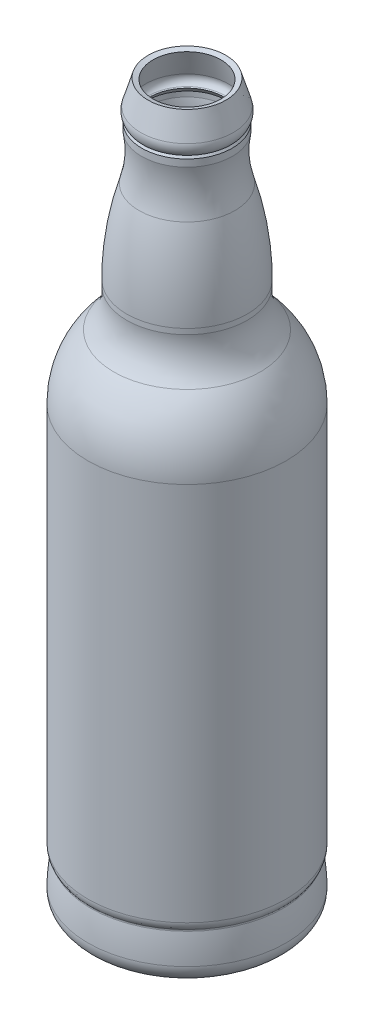
ISO-10303-21;
HEADER;
FILE_DESCRIPTION(('STEP AP214'),'2;1');
FILE_NAME('part.step','',(''),(''),'','','');
FILE_SCHEMA(('AUTOMOTIVE_DESIGN { 1 0 10303 214 1 1 1 1 }'));
ENDSEC;
DATA;
#1=APPLICATION_CONTEXT('core data for automotive mechanical design processes');
#2=APPLICATION_PROTOCOL_DEFINITION('international standard','automotive_design',2000,#1);
#3=PRODUCT_CONTEXT('',#1,'mechanical');
#4=PRODUCT('Part','Part','',(#3));
#5=PRODUCT_RELATED_PRODUCT_CATEGORY('part','',(#4));
#6=PRODUCT_DEFINITION_FORMATION('','',#4);
#7=PRODUCT_DEFINITION_CONTEXT('part definition',#1,'design');
#8=PRODUCT_DEFINITION('design','',#6,#7);
#9=PRODUCT_DEFINITION_SHAPE('','',#8);
#10=(LENGTH_UNIT() NAMED_UNIT(*) SI_UNIT(.MILLI.,.METRE.));
#11=(NAMED_UNIT(*) PLANE_ANGLE_UNIT() SI_UNIT($,.RADIAN.));
#12=(NAMED_UNIT(*) SI_UNIT($,.STERADIAN.) SOLID_ANGLE_UNIT());
#13=UNCERTAINTY_MEASURE_WITH_UNIT(LENGTH_MEASURE(1.E-05),#10,'distance_accuracy_value','');
#14=(GEOMETRIC_REPRESENTATION_CONTEXT(3) GLOBAL_UNCERTAINTY_ASSIGNED_CONTEXT((#13)) GLOBAL_UNIT_ASSIGNED_CONTEXT((#10,
#11,#12)) REPRESENTATION_CONTEXT('',''));
#15=CARTESIAN_POINT('',(0.,0.,0.));
#16=DIRECTION('',(0.,0.,1.));
#17=DIRECTION('',(1.,0.,0.));
#18=AXIS2_PLACEMENT_3D('',#15,#16,#17);
#19=CARTESIAN_POINT('',(0.,277.5,0.));
#20=DIRECTION('',(0.,1.,0.));
#21=DIRECTION('',(0.,0.,1.));
#22=AXIS2_PLACEMENT_3D('',#19,#20,#21);
#23=CONICAL_SURFACE('',#22,13.25,1.27910514982229);
#24=CARTESIAN_POINT('',(0.,277.5,0.));
#25=DIRECTION('',(0.,1.,0.));
#26=DIRECTION('',(0.,0.,1.));
#27=AXIS2_PLACEMENT_3D('',#24,#25,#26);
#28=CIRCLE('',#27,13.25);
#29=CARTESIAN_POINT('',(0.,277.5,13.25));
#30=VERTEX_POINT('',#29);
#31=EDGE_CURVE('E97',#30,#30,#28,.T.);
#32=ORIENTED_EDGE('',*,*,#31,.F.);
#33=EDGE_LOOP('',(#32));
#34=FACE_BOUND('',#33,.T.);
#35=CARTESIAN_POINT('',(0.,278.075144750772,0.));
#36=DIRECTION('',(0.,-1.,0.));
#37=DIRECTION('',(0.,0.,-1.));
#38=AXIS2_PLACEMENT_3D('',#35,#36,#37);
#39=CIRCLE('',#38,15.1655178191966);
#40=CARTESIAN_POINT('',(0.,278.075144750772,-15.1655178191966));
#41=VERTEX_POINT('',#40);
#42=EDGE_CURVE('E100',#41,#41,#39,.F.);
#43=ORIENTED_EDGE('',*,*,#42,.T.);
#44=EDGE_LOOP('',(#43));
#45=FACE_BOUND('',#44,.T.);
#46=ADVANCED_FACE('F49',(#34,#45),#23,.F.);
#47=CARTESIAN_POINT('',(0.,-17.5593913048287,0.));
#48=DIRECTION('',(0.,1.,0.));
#49=DIRECTION('',(0.,0.,1.));
#50=AXIS2_PLACEMENT_3D('',#47,#48,#49);
#51=CYLINDRICAL_SURFACE('',#50,36.65);
#52=CARTESIAN_POINT('',(0.,168.,0.));
#53=DIRECTION('',(0.,1.,0.));
#54=DIRECTION('',(0.,0.,1.));
#55=AXIS2_PLACEMENT_3D('',#52,#53,#54);
#56=CIRCLE('',#55,36.65);
#57=CARTESIAN_POINT('',(0.,168.,36.65));
#58=VERTEX_POINT('',#57);
#59=EDGE_CURVE('E13',#58,#58,#56,.T.);
#60=ORIENTED_EDGE('',*,*,#59,.T.);
#61=EDGE_LOOP('',(#60));
#62=FACE_BOUND('',#61,.T.);
#63=CARTESIAN_POINT('',(0.,20.0146178905804,0.));
#64=DIRECTION('',(0.,1.,0.));
#65=DIRECTION('',(0.,0.,1.));
#66=AXIS2_PLACEMENT_3D('',#63,#64,#65);
#67=CIRCLE('',#66,36.65);
#68=CARTESIAN_POINT('',(0.,20.0146178905804,36.65));
#69=VERTEX_POINT('',#68);
#70=EDGE_CURVE('E173',#69,#69,#67,.T.);
#71=ORIENTED_EDGE('',*,*,#70,.F.);
#72=EDGE_LOOP('',(#71));
#73=FACE_BOUND('',#72,.T.);
#74=ADVANCED_FACE('F84',(#62,#73),#51,.F.);
#75=CARTESIAN_POINT('',(0.,168.,0.));
#76=DIRECTION('',(0.,1.,0.));
#77=DIRECTION('',(0.,0.,1.));
#78=AXIS2_PLACEMENT_3D('',#75,#76,#77);
#79=DEGENERATE_TOROIDAL_SURFACE('',#78,2.65,34.,.T.);
#80=CARTESIAN_POINT('',(0.,191.598656068639,0.));
#81=DIRECTION('',(0.,1.,0.));
#82=DIRECTION('',(0.,0.,1.));
#83=AXIS2_PLACEMENT_3D('',#80,#81,#82);
#84=CIRCLE('',#83,27.1265894632829);
#85=CARTESIAN_POINT('',(0.,191.598656068639,27.1265894632829));
#86=VERTEX_POINT('',#85);
#87=EDGE_CURVE('E58',#86,#86,#84,.T.);
#88=ORIENTED_EDGE('',*,*,#87,.T.);
#89=EDGE_LOOP('',(#88));
#90=FACE_BOUND('',#89,.T.);
#91=ORIENTED_EDGE('',*,*,#59,.F.);
#92=EDGE_LOOP('',(#91));
#93=FACE_BOUND('',#92,.T.);
#94=ADVANCED_FACE('F91',(#90,#93),#79,.F.);
#95=CARTESIAN_POINT('',(0.,205.827257521789,0.));
#96=DIRECTION('',(0.,1.,0.));
#97=DIRECTION('',(0.,0.,1.));
#98=AXIS2_PLACEMENT_3D('',#95,#96,#97);
#99=TOROIDAL_SURFACE('',#98,41.8845331102622,20.5);
#100=CARTESIAN_POINT('',(0.,208.,0.));
#101=DIRECTION('',(0.,1.,0.));
#102=DIRECTION('',(0.,0.,1.));
#103=AXIS2_PLACEMENT_3D('',#100,#101,#102);
#104=CIRCLE('',#103,21.5);
#105=CARTESIAN_POINT('',(0.,208.,21.5));
#106=VERTEX_POINT('',#105);
#107=EDGE_CURVE('E131',#106,#106,#104,.T.);
#108=ORIENTED_EDGE('',*,*,#107,.T.);
#109=EDGE_LOOP('',(#108));
#110=FACE_BOUND('',#109,.T.);
#111=ORIENTED_EDGE('',*,*,#87,.F.);
#112=EDGE_LOOP('',(#111));
#113=FACE_BOUND('',#112,.T.);
#114=ADVANCED_FACE('F273',(#110,#113),#99,.T.);
#115=CARTESIAN_POINT('',(0.,-17.5593913048287,0.));
#116=DIRECTION('',(0.,1.,0.));
#117=DIRECTION('',(0.,0.,1.));
#118=AXIS2_PLACEMENT_3D('',#115,#116,#117);
#119=CYLINDRICAL_SURFACE('',#118,21.5);
#120=CARTESIAN_POINT('',(0.,210.,0.));
#121=DIRECTION('',(0.,1.,0.));
#122=DIRECTION('',(0.,0.,1.));
#123=AXIS2_PLACEMENT_3D('',#120,#121,#122);
#124=CIRCLE('',#123,21.5);
#125=CARTESIAN_POINT('',(0.,210.,21.5));
#126=VERTEX_POINT('',#125);
#127=EDGE_CURVE('E134',#126,#126,#124,.T.);
#128=ORIENTED_EDGE('',*,*,#127,.T.);
#129=EDGE_LOOP('',(#128));
#130=FACE_BOUND('',#129,.T.);
#131=ORIENTED_EDGE('',*,*,#107,.F.);
#132=EDGE_LOOP('',(#131));
#133=FACE_BOUND('',#132,.T.);
#134=ADVANCED_FACE('F269',(#130,#133),#119,.F.);
#135=CARTESIAN_POINT('',(0.,210.,0.));
#136=DIRECTION('',(0.,1.,0.));
#137=DIRECTION('',(0.,0.,1.));
#138=AXIS2_PLACEMENT_3D('',#135,#136,#137);
#139=DEGENERATE_TOROIDAL_SURFACE('',#138,88.6,110.1,.F.);
#140=CARTESIAN_POINT('',(0.,241.94796364899,0.));
#141=DIRECTION('',(0.,1.,0.));
#142=DIRECTION('',(0.,0.,1.));
#143=AXIS2_PLACEMENT_3D('',#140,#141,#142);
#144=CIRCLE('',#143,16.7628853946343);
#145=CARTESIAN_POINT('',(0.,241.94796364899,16.7628853946343));
#146=VERTEX_POINT('',#145);
#147=EDGE_CURVE('E137',#146,#146,#144,.T.);
#148=ORIENTED_EDGE('',*,*,#147,.T.);
#149=EDGE_LOOP('',(#148));
#150=FACE_BOUND('',#149,.T.);
#151=ORIENTED_EDGE('',*,*,#127,.F.);
#152=EDGE_LOOP('',(#151));
#153=FACE_BOUND('',#152,.T.);
#154=ADVANCED_FACE('F265',(#150,#153),#139,.T.);
#155=CARTESIAN_POINT('',(0.,253.554853258068,0.));
#156=DIRECTION('',(0.,1.,0.));
#157=DIRECTION('',(0.,0.,1.));
#158=AXIS2_PLACEMENT_3D('',#155,#156,#157);
#159=TOROIDAL_SURFACE('',#158,55.041862831377,40.);
#160=CARTESIAN_POINT('',(0.,260.5,0.));
#161=DIRECTION('',(0.,1.,0.));
#162=DIRECTION('',(0.,0.,1.));
#163=AXIS2_PLACEMENT_3D('',#160,#161,#162);
#164=CIRCLE('',#163,15.6494151194991);
#165=CARTESIAN_POINT('',(0.,260.5,15.6494151194991));
#166=VERTEX_POINT('',#165);
#167=EDGE_CURVE('E140',#166,#166,#164,.T.);
#168=ORIENTED_EDGE('',*,*,#167,.T.);
#169=EDGE_LOOP('',(#168));
#170=FACE_BOUND('',#169,.T.);
#171=ORIENTED_EDGE('',*,*,#147,.F.);
#172=EDGE_LOOP('',(#171));
#173=FACE_BOUND('',#172,.T.);
#174=ADVANCED_FACE('F261',(#170,#173),#159,.T.);
#175=CARTESIAN_POINT('',(0.,-17.5593913048287,0.));
#176=DIRECTION('',(0.,1.,0.));
#177=DIRECTION('',(0.,0.,1.));
#178=AXIS2_PLACEMENT_3D('',#175,#176,#177);
#179=CYLINDRICAL_SURFACE('',#178,15.6494151194991);
#180=CARTESIAN_POINT('',(0.,262.5,0.));
#181=DIRECTION('',(0.,1.,0.));
#182=DIRECTION('',(0.,0.,1.));
#183=AXIS2_PLACEMENT_3D('',#180,#181,#182);
#184=CIRCLE('',#183,15.6494151194991);
#185=CARTESIAN_POINT('',(0.,262.5,15.6494151194991));
#186=VERTEX_POINT('',#185);
#187=EDGE_CURVE('E143',#186,#186,#184,.T.);
#188=ORIENTED_EDGE('',*,*,#187,.T.);
#189=EDGE_LOOP('',(#188));
#190=FACE_BOUND('',#189,.T.);
#191=ORIENTED_EDGE('',*,*,#167,.F.);
#192=EDGE_LOOP('',(#191));
#193=FACE_BOUND('',#192,.T.);
#194=ADVANCED_FACE('F257',(#190,#193),#179,.F.);
#195=CARTESIAN_POINT('',(0.,262.5,0.));
#196=DIRECTION('',(0.,-1.,0.));
#197=DIRECTION('',(0.,0.,-1.));
#198=AXIS2_PLACEMENT_3D('',#195,#196,#197);
#199=CONICAL_SURFACE('',#198,15.6494151194991,0.573236750858005);
#200=CARTESIAN_POINT('',(0.,264.322192830936,0.));
#201=DIRECTION('',(0.,1.,0.));
#202=DIRECTION('',(0.,0.,1.));
#203=AXIS2_PLACEMENT_3D('',#200,#201,#202);
#204=CIRCLE('',#203,14.473108375119);
#205=CARTESIAN_POINT('',(0.,264.322192830936,14.473108375119));
#206=VERTEX_POINT('',#205);
#207=EDGE_CURVE('E146',#206,#206,#204,.T.);
#208=ORIENTED_EDGE('',*,*,#207,.T.);
#209=EDGE_LOOP('',(#208));
#210=FACE_BOUND('',#209,.T.);
#211=ORIENTED_EDGE('',*,*,#187,.F.);
#212=EDGE_LOOP('',(#211));
#213=FACE_BOUND('',#212,.T.);
#214=ADVANCED_FACE('F253',(#210,#213),#199,.F.);
#215=CARTESIAN_POINT('',(0.,264.322192830936,0.));
#216=DIRECTION('',(0.,1.,0.));
#217=DIRECTION('',(0.,0.,1.));
#218=AXIS2_PLACEMENT_3D('',#215,#216,#217);
#219=CONICAL_SURFACE('',#218,14.473108375119,0.997559575936823);
#220=CARTESIAN_POINT('',(0.,264.577188359089,0.));
#221=DIRECTION('',(0.,1.,0.));
#222=DIRECTION('',(0.,0.,1.));
#223=AXIS2_PLACEMENT_3D('',#220,#221,#222);
#224=CIRCLE('',#223,14.8681167566846);
#225=CARTESIAN_POINT('',(0.,264.577188359089,14.8681167566846));
#226=VERTEX_POINT('',#225);
#227=EDGE_CURVE('E149',#226,#226,#224,.T.);
#228=ORIENTED_EDGE('',*,*,#227,.T.);
#229=EDGE_LOOP('',(#228));
#230=FACE_BOUND('',#229,.T.);
#231=ORIENTED_EDGE('',*,*,#207,.F.);
#232=EDGE_LOOP('',(#231));
#233=FACE_BOUND('',#232,.T.);
#234=ADVANCED_FACE('F249',(#230,#233),#219,.F.);
#235=CARTESIAN_POINT('',(0.,267.097638099913,0.));
#236=DIRECTION('',(0.,1.,0.));
#237=DIRECTION('',(0.,0.,1.));
#238=AXIS2_PLACEMENT_3D('',#235,#236,#237);
#239=TOROIDAL_SURFACE('',#238,13.2410540338667,2.99999999999999);
#240=CARTESIAN_POINT('',(0.,267.96035522607,0.));
#241=DIRECTION('',(0.,1.,0.));
#242=DIRECTION('',(0.,0.,1.));
#243=AXIS2_PLACEMENT_3D('',#240,#241,#242);
#244=CIRCLE('',#243,16.1143307626617);
#245=CARTESIAN_POINT('',(0.,267.96035522607,16.1143307626617));
#246=VERTEX_POINT('',#245);
#247=EDGE_CURVE('E127',#246,#246,#244,.T.);
#248=ORIENTED_EDGE('',*,*,#247,.T.);
#249=EDGE_LOOP('',(#248));
#250=FACE_BOUND('',#249,.T.);
#251=ORIENTED_EDGE('',*,*,#227,.F.);
#252=EDGE_LOOP('',(#251));
#253=FACE_BOUND('',#252,.T.);
#254=ADVANCED_FACE('F245',(#250,#253),#239,.F.);
#255=CARTESIAN_POINT('',(0.,267.96035522607,0.));
#256=DIRECTION('',(0.,-1.,0.));
#257=DIRECTION('',(0.,0.,-1.));
#258=AXIS2_PLACEMENT_3D('',#255,#256,#257);
#259=CONICAL_SURFACE('',#258,16.1143307626617,0.291691176972609);
#260=ORIENTED_EDGE('',*,*,#31,.T.);
#261=EDGE_LOOP('',(#260));
#262=FACE_BOUND('',#261,.T.);
#263=ORIENTED_EDGE('',*,*,#247,.F.);
#264=EDGE_LOOP('',(#263));
#265=FACE_BOUND('',#264,.T.);
#266=ADVANCED_FACE('F241',(#262,#265),#259,.F.);
#267=CARTESIAN_POINT('',(0.,-17.5593913048287,0.));
#268=DIRECTION('',(0.,1.,0.));
#269=DIRECTION('',(0.,0.,1.));
#270=AXIS2_PLACEMENT_3D('',#267,#268,#269);
#271=CYLINDRICAL_SURFACE('',#270,38.65);
#272=CARTESIAN_POINT('',(0.,168.,0.));
#273=DIRECTION('',(0.,1.,0.));
#274=DIRECTION('',(0.,0.,1.));
#275=AXIS2_PLACEMENT_3D('',#272,#273,#274);
#276=CIRCLE('',#275,38.65);
#277=CARTESIAN_POINT('',(0.,168.,38.65));
#278=VERTEX_POINT('',#277);
#279=EDGE_CURVE('E125',#278,#278,#276,.T.);
#280=ORIENTED_EDGE('',*,*,#279,.F.);
#281=EDGE_LOOP('',(#280));
#282=FACE_BOUND('',#281,.T.);
#283=CARTESIAN_POINT('',(0.,20.0146178905804,0.));
#284=DIRECTION('',(0.,1.,0.));
#285=DIRECTION('',(0.,0.,1.));
#286=AXIS2_PLACEMENT_3D('',#283,#284,#285);
#287=CIRCLE('',#286,38.65);
#288=CARTESIAN_POINT('',(0.,20.0146178905804,38.65));
#289=VERTEX_POINT('',#288);
#290=EDGE_CURVE('E155',#289,#289,#287,.T.);
#291=ORIENTED_EDGE('',*,*,#290,.T.);
#292=EDGE_LOOP('',(#291));
#293=FACE_BOUND('',#292,.T.);
#294=ADVANCED_FACE('F244',(#282,#293),#271,.T.);
#295=CARTESIAN_POINT('',(0.,168.,0.));
#296=DIRECTION('',(0.,1.,0.));
#297=DIRECTION('',(0.,0.,1.));
#298=AXIS2_PLACEMENT_3D('',#295,#296,#297);
#299=DEGENERATE_TOROIDAL_SURFACE('',#298,2.65,36.,.T.);
#300=CARTESIAN_POINT('',(0.,192.986812307971,0.));
#301=DIRECTION('',(0.,1.,0.));
#302=DIRECTION('',(0.,0.,1.));
#303=AXIS2_PLACEMENT_3D('',#300,#301,#302);
#304=CIRCLE('',#303,28.566388843476);
#305=CARTESIAN_POINT('',(0.,192.986812307971,28.566388843476));
#306=VERTEX_POINT('',#305);
#307=EDGE_CURVE('E122',#306,#306,#304,.T.);
#308=ORIENTED_EDGE('',*,*,#307,.F.);
#309=EDGE_LOOP('',(#308));
#310=FACE_BOUND('',#309,.T.);
#311=ORIENTED_EDGE('',*,*,#279,.T.);
#312=EDGE_LOOP('',(#311));
#313=FACE_BOUND('',#312,.T.);
#314=ADVANCED_FACE('F282',(#310,#313),#299,.T.);
#315=CARTESIAN_POINT('',(0.,205.827257521789,0.));
#316=DIRECTION('',(0.,1.,0.));
#317=DIRECTION('',(0.,0.,1.));
#318=AXIS2_PLACEMENT_3D('',#315,#316,#317);
#319=TOROIDAL_SURFACE('',#318,41.8845331102622,18.5);
#320=CARTESIAN_POINT('',(0.,207.890978025557,0.));
#321=DIRECTION('',(0.,-1.,0.));
#322=DIRECTION('',(0.,0.,-1.));
#323=AXIS2_PLACEMENT_3D('',#320,#321,#322);
#324=CIRCLE('',#323,23.5);
#325=CARTESIAN_POINT('',(0.,207.890978025557,-23.5));
#326=VERTEX_POINT('',#325);
#327=EDGE_CURVE('E119',#326,#326,#324,.F.);
#328=ORIENTED_EDGE('',*,*,#327,.F.);
#329=EDGE_LOOP('',(#328));
#330=FACE_BOUND('',#329,.T.);
#331=ORIENTED_EDGE('',*,*,#307,.T.);
#332=EDGE_LOOP('',(#331));
#333=FACE_BOUND('',#332,.T.);
#334=ADVANCED_FACE('F285',(#330,#333),#319,.F.);
#335=CARTESIAN_POINT('',(0.,-17.5593913048287,0.));
#336=DIRECTION('',(0.,1.,0.));
#337=DIRECTION('',(0.,0.,1.));
#338=AXIS2_PLACEMENT_3D('',#335,#336,#337);
#339=CYLINDRICAL_SURFACE('',#338,23.5);
#340=CARTESIAN_POINT('',(0.,210.,0.));
#341=DIRECTION('',(0.,1.,0.));
#342=DIRECTION('',(0.,0.,1.));
#343=AXIS2_PLACEMENT_3D('',#340,#341,#342);
#344=CIRCLE('',#343,23.5);
#345=CARTESIAN_POINT('',(0.,210.,23.5));
#346=VERTEX_POINT('',#345);
#347=EDGE_CURVE('E116',#346,#346,#344,.T.);
#348=ORIENTED_EDGE('',*,*,#347,.F.);
#349=EDGE_LOOP('',(#348));
#350=FACE_BOUND('',#349,.T.);
#351=ORIENTED_EDGE('',*,*,#327,.T.);
#352=EDGE_LOOP('',(#351));
#353=FACE_BOUND('',#352,.T.);
#354=ADVANCED_FACE('F289',(#350,#353),#339,.T.);
#355=CARTESIAN_POINT('',(0.,210.,0.));
#356=DIRECTION('',(0.,1.,0.));
#357=DIRECTION('',(0.,0.,1.));
#358=AXIS2_PLACEMENT_3D('',#355,#356,#357);
#359=DEGENERATE_TOROIDAL_SURFACE('',#358,88.6,112.1,.F.);
#360=CARTESIAN_POINT('',(0.,242.528308129443,0.));
#361=DIRECTION('',(0.,1.,0.));
#362=DIRECTION('',(0.,0.,1.));
#363=AXIS2_PLACEMENT_3D('',#360,#361,#362);
#364=CIRCLE('',#363,18.6768342664714);
#365=CARTESIAN_POINT('',(0.,242.528308129443,18.6768342664714));
#366=VERTEX_POINT('',#365);
#367=EDGE_CURVE('E113',#366,#366,#364,.T.);
#368=ORIENTED_EDGE('',*,*,#367,.F.);
#369=EDGE_LOOP('',(#368));
#370=FACE_BOUND('',#369,.T.);
#371=ORIENTED_EDGE('',*,*,#347,.T.);
#372=EDGE_LOOP('',(#371));
#373=FACE_BOUND('',#372,.T.);
#374=ADVANCED_FACE('F293',(#370,#373),#359,.F.);
#375=CARTESIAN_POINT('',(0.,253.554853258068,0.));
#376=DIRECTION('',(0.,1.,0.));
#377=DIRECTION('',(0.,0.,1.));
#378=AXIS2_PLACEMENT_3D('',#375,#376,#377);
#379=TOROIDAL_SURFACE('',#378,55.041862831377,38.);
#380=CARTESIAN_POINT('',(0.,260.32278160539,0.));
#381=DIRECTION('',(0.,-1.,0.));
#382=DIRECTION('',(0.,0.,-1.));
#383=AXIS2_PLACEMENT_3D('',#380,#381,#382);
#384=CIRCLE('',#383,17.6494151194991);
#385=CARTESIAN_POINT('',(0.,260.32278160539,-17.6494151194991));
#386=VERTEX_POINT('',#385);
#387=EDGE_CURVE('E110',#386,#386,#384,.F.);
#388=ORIENTED_EDGE('',*,*,#387,.F.);
#389=EDGE_LOOP('',(#388));
#390=FACE_BOUND('',#389,.T.);
#391=ORIENTED_EDGE('',*,*,#367,.T.);
#392=EDGE_LOOP('',(#391));
#393=FACE_BOUND('',#392,.T.);
#394=ADVANCED_FACE('F297',(#390,#393),#379,.F.);
#395=CARTESIAN_POINT('',(0.,-17.5593913048287,0.));
#396=DIRECTION('',(0.,1.,0.));
#397=DIRECTION('',(0.,0.,1.));
#398=AXIS2_PLACEMENT_3D('',#395,#396,#397);
#399=CYLINDRICAL_SURFACE('',#398,17.6494151194991);
#400=CARTESIAN_POINT('',(0.,263.089467452547,0.));
#401=DIRECTION('',(0.,-1.,0.));
#402=DIRECTION('',(0.,0.,-1.));
#403=AXIS2_PLACEMENT_3D('',#400,#401,#402);
#404=CIRCLE('',#403,17.6494151194991);
#405=CARTESIAN_POINT('',(0.,263.089467452547,-17.6494151194991));
#406=VERTEX_POINT('',#405);
#407=EDGE_CURVE('E103',#406,#406,#404,.F.);
#408=ORIENTED_EDGE('',*,*,#407,.F.);
#409=EDGE_LOOP('',(#408));
#410=FACE_BOUND('',#409,.T.);
#411=ORIENTED_EDGE('',*,*,#387,.T.);
#412=EDGE_LOOP('',(#411));
#413=FACE_BOUND('',#412,.T.);
#414=ADVANCED_FACE('F301',(#410,#413),#399,.T.);
#415=CARTESIAN_POINT('',(0.,263.584708481879,0.));
#416=DIRECTION('',(0.,-1.,0.));
#417=DIRECTION('',(0.,0.,-1.));
#418=AXIS2_PLACEMENT_3D('',#415,#416,#417);
#419=CONICAL_SURFACE('',#418,17.3297149467146,0.573236750858005);
#420=ORIENTED_EDGE('',*,*,#407,.T.);
#421=EDGE_LOOP('',(#420));
#422=FACE_BOUND('',#421,.T.);
#423=CARTESIAN_POINT('',(0.,263.928060762459,0.));
#424=DIRECTION('',(0.,1.,0.));
#425=DIRECTION('',(0.,0.,1.));
#426=AXIS2_PLACEMENT_3D('',#423,#424,#425);
#427=CIRCLE('',#426,17.1080657356719);
#428=CARTESIAN_POINT('',(0.,263.928060762459,17.1080657356719));
#429=VERTEX_POINT('',#428);
#430=EDGE_CURVE('E52',#429,#429,#427,.T.);
#431=ORIENTED_EDGE('',*,*,#430,.F.);
#432=EDGE_LOOP('',(#431));
#433=FACE_BOUND('',#432,.T.);
#434=ADVANCED_FACE('F305',(#422,#433),#419,.T.);
#435=CARTESIAN_POINT('',(0.,267.097638099913,0.));
#436=DIRECTION('',(0.,1.,0.));
#437=DIRECTION('',(0.,0.,1.));
#438=AXIS2_PLACEMENT_3D('',#435,#436,#437);
#439=TOROIDAL_SURFACE('',#438,13.2410540338667,4.99999999999999);
#440=CARTESIAN_POINT('',(0.,268.535499976842,0.));
#441=DIRECTION('',(0.,1.,0.));
#442=DIRECTION('',(0.,0.,1.));
#443=AXIS2_PLACEMENT_3D('',#440,#441,#442);
#444=CIRCLE('',#443,18.0298485818583);
#445=CARTESIAN_POINT('',(0.,268.535499976842,18.0298485818583));
#446=VERTEX_POINT('',#445);
#447=EDGE_CURVE('E101',#446,#446,#444,.T.);
#448=ORIENTED_EDGE('',*,*,#447,.F.);
#449=EDGE_LOOP('',(#448));
#450=FACE_BOUND('',#449,.T.);
#451=ORIENTED_EDGE('',*,*,#430,.T.);
#452=EDGE_LOOP('',(#451));
#453=FACE_BOUND('',#452,.T.);
#454=ADVANCED_FACE('F78',(#450,#453),#439,.T.);
#455=CARTESIAN_POINT('',(0.,268.535499976842,0.));
#456=DIRECTION('',(0.,-1.,0.));
#457=DIRECTION('',(0.,0.,-1.));
#458=AXIS2_PLACEMENT_3D('',#455,#456,#457);
#459=CONICAL_SURFACE('',#458,18.0298485818583,0.291691176972609);
#460=ORIENTED_EDGE('',*,*,#42,.F.);
#461=EDGE_LOOP('',(#460));
#462=FACE_BOUND('',#461,.T.);
#463=ORIENTED_EDGE('',*,*,#447,.T.);
#464=EDGE_LOOP('',(#463));
#465=FACE_BOUND('',#464,.T.);
#466=ADVANCED_FACE('F67',(#462,#465),#459,.T.);
#467=CARTESIAN_POINT('',(0.,-153.977718049209,1.08777554035935));
#468=DIRECTION('',(-1.,0.,0.));
#469=DIRECTION('',(0.,0.,1.));
#470=AXIS2_PLACEMENT_3D('',#467,#468,#469);
#471=CIRCLE('',#470,154.981486868876);
#472=TRIMMED_CURVE('',#471,(PARAMETER_VALUE(-1.57781512945111)),
(PARAMETER_VALUE(1.57781512945111)),.T.,.PARAMETER.);
#473=CARTESIAN_POINT('',(0.,-153.977718049209,0.));
#474=DIRECTION('',(0.,1.,0.));
#475=AXIS1_PLACEMENT('',#473,#474);
#476=SURFACE_OF_REVOLUTION('',#472,#475);
#477=CARTESIAN_POINT('',(0.,-1.89355797851321,0.));
#478=DIRECTION('',(0.,1.,0.));
#479=DIRECTION('',(0.,0.,1.));
#480=AXIS2_PLACEMENT_3D('',#477,#478,#479);
#481=CIRCLE('',#480,30.9151040777697);
#482=CARTESIAN_POINT('',(0.,-1.89355797851321,30.9151040777697));
#483=VERTEX_POINT('',#482);
#484=EDGE_CURVE('E170',#483,#483,#481,.T.);
#485=ORIENTED_EDGE('',*,*,#484,.F.);
#486=EDGE_LOOP('',(#485));
#487=FACE_BOUND('',#486,.T.);
#488=CARTESIAN_POINT('',(0.,0.999951363069351,0.));
#489=VERTEX_POINT('',#488);
#490=VERTEX_LOOP('',#489);
#491=FACE_BOUND('',#490,.T.);
#492=ADVANCED_FACE('F64',(#487,#491),#476,.F.);
#493=CARTESIAN_POINT('',(0.,3.0129687022951,0.));
#494=DIRECTION('',(0.,1.,0.));
#495=DIRECTION('',(0.,0.,1.));
#496=AXIS2_PLACEMENT_3D('',#493,#494,#495);
#497=TOROIDAL_SURFACE('',#496,31.8773909011839,5.);
#498=CARTESIAN_POINT('',(0.,-1.95460954196712,0.));
#499=DIRECTION('',(0.,1.,0.));
#500=DIRECTION('',(0.,0.,1.));
#501=AXIS2_PLACEMENT_3D('',#498,#499,#500);
#502=CIRCLE('',#501,32.4458681541436);
#503=CARTESIAN_POINT('',(0.,-1.95460954196712,32.4458681541436));
#504=VERTEX_POINT('',#503);
#505=EDGE_CURVE('E167',#504,#504,#502,.T.);
#506=ORIENTED_EDGE('',*,*,#505,.F.);
#507=EDGE_LOOP('',(#506));
#508=FACE_BOUND('',#507,.T.);
#509=ORIENTED_EDGE('',*,*,#484,.T.);
#510=EDGE_LOOP('',(#509));
#511=FACE_BOUND('',#510,.T.);
#512=ADVANCED_FACE('F66',(#508,#511),#497,.T.);
#513=CARTESIAN_POINT('',(0.,5.,0.));
#514=DIRECTION('',(0.,1.,0.));
#515=DIRECTION('',(0.,0.,1.));
#516=AXIS2_PLACEMENT_3D('',#513,#514,#515);
#517=TOROIDAL_SURFACE('',#516,31.65,6.99999999999999);
#518=CARTESIAN_POINT('',(0.,5.2,0.));
#519=DIRECTION('',(0.,1.,0.));
#520=DIRECTION('',(0.,0.,1.));
#521=AXIS2_PLACEMENT_3D('',#518,#519,#520);
#522=CIRCLE('',#521,38.6471422738144);
#523=CARTESIAN_POINT('',(0.,5.2,38.6471422738144));
#524=VERTEX_POINT('',#523);
#525=EDGE_CURVE('E164',#524,#524,#522,.T.);
#526=ORIENTED_EDGE('',*,*,#525,.F.);
#527=EDGE_LOOP('',(#526));
#528=FACE_BOUND('',#527,.T.);
#529=ORIENTED_EDGE('',*,*,#505,.T.);
#530=EDGE_LOOP('',(#529));
#531=FACE_BOUND('',#530,.T.);
#532=ADVANCED_FACE('F74',(#528,#531),#517,.T.);
#533=CARTESIAN_POINT('',(0.,3.,0.));
#534=DIRECTION('',(0.,1.,0.));
#535=DIRECTION('',(0.,0.,1.));
#536=AXIS2_PLACEMENT_3D('',#533,#534,#535);
#537=DEGENERATE_TOROIDAL_SURFACE('',#536,38.3214227381436,77.,.F.);
#538=CARTESIAN_POINT('',(0.,16.3143801553009,0.));
#539=DIRECTION('',(0.,1.,0.));
#540=DIRECTION('',(0.,0.,1.));
#541=AXIS2_PLACEMENT_3D('',#538,#539,#540);
#542=CIRCLE('',#541,37.5187202013322);
#543=CARTESIAN_POINT('',(0.,16.3143801553009,37.5187202013322));
#544=VERTEX_POINT('',#543);
#545=EDGE_CURVE('E161',#544,#544,#542,.T.);
#546=ORIENTED_EDGE('',*,*,#545,.F.);
#547=EDGE_LOOP('',(#546));
#548=FACE_BOUND('',#547,.T.);
#549=ORIENTED_EDGE('',*,*,#525,.T.);
#550=EDGE_LOOP('',(#549));
#551=FACE_BOUND('',#550,.T.);
#552=ADVANCED_FACE('F234',(#548,#551),#537,.F.);
#553=CARTESIAN_POINT('',(0.,16.4872941832918,0.));
#554=DIRECTION('',(0.,1.,0.));
#555=DIRECTION('',(0.,0.,1.));
#556=AXIS2_PLACEMENT_3D('',#553,#554,#555);
#557=TOROIDAL_SURFACE('',#556,38.5036571226241,1.00000000000001);
#558=CARTESIAN_POINT('',(0.,17.0751814678399,0.));
#559=DIRECTION('',(0.,1.,0.));
#560=DIRECTION('',(0.,0.,1.));
#561=AXIS2_PLACEMENT_3D('',#558,#559,#560);
#562=CIRCLE('',#561,37.6947142688535);
#563=CARTESIAN_POINT('',(0.,17.0751814678399,37.6947142688535));
#564=VERTEX_POINT('',#563);
#565=EDGE_CURVE('E158',#564,#564,#562,.T.);
#566=ORIENTED_EDGE('',*,*,#565,.F.);
#567=EDGE_LOOP('',(#566));
#568=FACE_BOUND('',#567,.T.);
#569=ORIENTED_EDGE('',*,*,#545,.T.);
#570=EDGE_LOOP('',(#569));
#571=FACE_BOUND('',#570,.T.);
#572=ADVANCED_FACE('F228',(#568,#571),#557,.F.);
#573=CARTESIAN_POINT('',(0.,20.0146178905804,0.));
#574=DIRECTION('',(0.,1.,0.));
#575=DIRECTION('',(0.,0.,1.));
#576=AXIS2_PLACEMENT_3D('',#573,#574,#575);
#577=TOROIDAL_SURFACE('',#576,33.65,5.);
#578=ORIENTED_EDGE('',*,*,#290,.F.);
#579=EDGE_LOOP('',(#578));
#580=FACE_BOUND('',#579,.T.);
#581=ORIENTED_EDGE('',*,*,#565,.T.);
#582=EDGE_LOOP('',(#581));
#583=FACE_BOUND('',#582,.T.);
#584=ADVANCED_FACE('F224',(#580,#583),#577,.T.);
#585=CARTESIAN_POINT('',(0.,-153.977718049209,1.08777554035935));
#586=DIRECTION('',(-1.,0.,0.));
#587=DIRECTION('',(0.,0.,1.));
#588=AXIS2_PLACEMENT_3D('',#585,#586,#587);
#589=CIRCLE('',#588,156.981486868876);
#590=TRIMMED_CURVE('',#589,(PARAMETER_VALUE(-1.57772570596733)),
(PARAMETER_VALUE(1.57772570596733)),.T.,.PARAMETER.);
#591=CARTESIAN_POINT('',(0.,-153.977718049209,0.));
#592=DIRECTION('',(0.,1.,0.));
#593=AXIS1_PLACEMENT('',#591,#592);
#594=SURFACE_OF_REVOLUTION('',#590,#593);
#595=CARTESIAN_POINT('',(0.,0.0690526938101066,0.));
#596=DIRECTION('',(0.,1.,0.));
#597=DIRECTION('',(0.,0.,1.));
#598=AXIS2_PLACEMENT_3D('',#595,#596,#597);
#599=CIRCLE('',#598,31.3000188071354);
#600=CARTESIAN_POINT('',(0.,0.0690526938101066,31.3000188071354));
#601=VERTEX_POINT('',#600);
#602=EDGE_CURVE('E105',#601,#601,#599,.T.);
#603=ORIENTED_EDGE('',*,*,#602,.T.);
#604=EDGE_LOOP('',(#603));
#605=FACE_BOUND('',#604,.T.);
#606=CARTESIAN_POINT('',(0.,2.99999999999995,0.));
#607=VERTEX_POINT('',#606);
#608=VERTEX_LOOP('',#607);
#609=FACE_BOUND('',#608,.T.);
#610=ADVANCED_FACE('F219',(#605,#609),#594,.T.);
#611=CARTESIAN_POINT('',(0.,3.0129687022951,0.));
#612=DIRECTION('',(0.,1.,0.));
#613=DIRECTION('',(0.,0.,1.));
#614=AXIS2_PLACEMENT_3D('',#611,#612,#613);
#615=TOROIDAL_SURFACE('',#614,31.8773909011839,3.);
#616=CARTESIAN_POINT('',(0.,0.0324217557377653,0.));
#617=DIRECTION('',(0.,1.,0.));
#618=DIRECTION('',(0.,0.,1.));
#619=AXIS2_PLACEMENT_3D('',#616,#617,#618);
#620=CIRCLE('',#619,32.2184772529597);
#621=CARTESIAN_POINT('',(0.,0.0324217557377653,32.2184772529597));
#622=VERTEX_POINT('',#621);
#623=EDGE_CURVE('E176',#622,#622,#620,.T.);
#624=ORIENTED_EDGE('',*,*,#623,.T.);
#625=EDGE_LOOP('',(#624));
#626=FACE_BOUND('',#625,.T.);
#627=ORIENTED_EDGE('',*,*,#602,.F.);
#628=EDGE_LOOP('',(#627));
#629=FACE_BOUND('',#628,.T.);
#630=ADVANCED_FACE('F213',(#626,#629),#615,.F.);
#631=CARTESIAN_POINT('',(0.,5.,0.));
#632=DIRECTION('',(0.,1.,0.));
#633=DIRECTION('',(0.,0.,1.));
#634=AXIS2_PLACEMENT_3D('',#631,#632,#633);
#635=TOROIDAL_SURFACE('',#634,31.65,4.99999999999999);
#636=CARTESIAN_POINT('',(0.,5.14285714285714,0.));
#637=DIRECTION('',(0.,1.,0.));
#638=DIRECTION('',(0.,0.,1.));
#639=AXIS2_PLACEMENT_3D('',#636,#637,#638);
#640=CIRCLE('',#639,36.6479587670103);
#641=CARTESIAN_POINT('',(0.,5.14285714285714,36.6479587670103));
#642=VERTEX_POINT('',#641);
#643=EDGE_CURVE('E179',#642,#642,#640,.T.);
#644=ORIENTED_EDGE('',*,*,#643,.T.);
#645=EDGE_LOOP('',(#644));
#646=FACE_BOUND('',#645,.T.);
#647=ORIENTED_EDGE('',*,*,#623,.F.);
#648=EDGE_LOOP('',(#647));
#649=FACE_BOUND('',#648,.T.);
#650=ADVANCED_FACE('F207',(#646,#649),#635,.F.);
#651=CARTESIAN_POINT('',(0.,3.,0.));
#652=DIRECTION('',(0.,1.,0.));
#653=DIRECTION('',(0.,0.,1.));
#654=AXIS2_PLACEMENT_3D('',#651,#652,#653);
#655=DEGENERATE_TOROIDAL_SURFACE('',#654,38.3214227381436,75.,.F.);
#656=CARTESIAN_POINT('',(0.,15.968552099319,0.));
#657=DIRECTION('',(0.,1.,0.));
#658=DIRECTION('',(0.,0.,1.));
#659=AXIS2_PLACEMENT_3D('',#656,#657,#658);
#660=CIRCLE('',#659,35.5488463587484);
#661=CARTESIAN_POINT('',(0.,15.968552099319,35.5488463587484));
#662=VERTEX_POINT('',#661);
#663=EDGE_CURVE('E182',#662,#662,#660,.T.);
#664=ORIENTED_EDGE('',*,*,#663,.T.);
#665=EDGE_LOOP('',(#664));
#666=FACE_BOUND('',#665,.T.);
#667=ORIENTED_EDGE('',*,*,#643,.F.);
#668=EDGE_LOOP('',(#667));
#669=FACE_BOUND('',#668,.T.);
#670=ADVANCED_FACE('F201',(#666,#669),#655,.T.);
#671=CARTESIAN_POINT('',(0.,16.4872941832918,0.));
#672=DIRECTION('',(0.,1.,0.));
#673=DIRECTION('',(0.,0.,1.));
#674=AXIS2_PLACEMENT_3D('',#671,#672,#673);
#675=TOROIDAL_SURFACE('',#674,38.5036571226241,3.00000000000001);
#676=CARTESIAN_POINT('',(0.,18.2509560369361,0.));
#677=DIRECTION('',(0.,1.,0.));
#678=DIRECTION('',(0.,0.,1.));
#679=AXIS2_PLACEMENT_3D('',#676,#677,#678);
#680=CIRCLE('',#679,36.0768285613121);
#681=CARTESIAN_POINT('',(0.,18.2509560369361,36.0768285613121));
#682=VERTEX_POINT('',#681);
#683=EDGE_CURVE('E185',#682,#682,#680,.T.);
#684=ORIENTED_EDGE('',*,*,#683,.T.);
#685=EDGE_LOOP('',(#684));
#686=FACE_BOUND('',#685,.T.);
#687=ORIENTED_EDGE('',*,*,#663,.F.);
#688=EDGE_LOOP('',(#687));
#689=FACE_BOUND('',#688,.T.);
#690=ADVANCED_FACE('F195',(#686,#689),#675,.T.);
#691=CARTESIAN_POINT('',(0.,20.0146178905804,0.));
#692=DIRECTION('',(0.,1.,0.));
#693=DIRECTION('',(0.,0.,1.));
#694=AXIS2_PLACEMENT_3D('',#691,#692,#693);
#695=TOROIDAL_SURFACE('',#694,33.65,3.);
#696=ORIENTED_EDGE('',*,*,#70,.T.);
#697=EDGE_LOOP('',(#696));
#698=FACE_BOUND('',#697,.T.);
#699=ORIENTED_EDGE('',*,*,#683,.F.);
#700=EDGE_LOOP('',(#699));
#701=FACE_BOUND('',#700,.T.);
#702=ADVANCED_FACE('F191',(#698,#701),#695,.F.);
#703=CLOSED_SHELL('',(#46,#74,#94,#114,#134,#154,#174,#194,#214,#234,#254,#266,#294,#314,#334,
#354,#374,#394,#414,#434,#454,#466,#492,#512,#532,#552,#572,#584,#610,#630,#650,#670,#690,#702));
#704=MANIFOLD_SOLID_BREP('B2',#703);
#705=ADVANCED_BREP_SHAPE_REPRESENTATION('',(#18,#704),#14);
#706=SHAPE_DEFINITION_REPRESENTATION(#9,#705);
ENDSEC;
END-ISO-10303-21;
